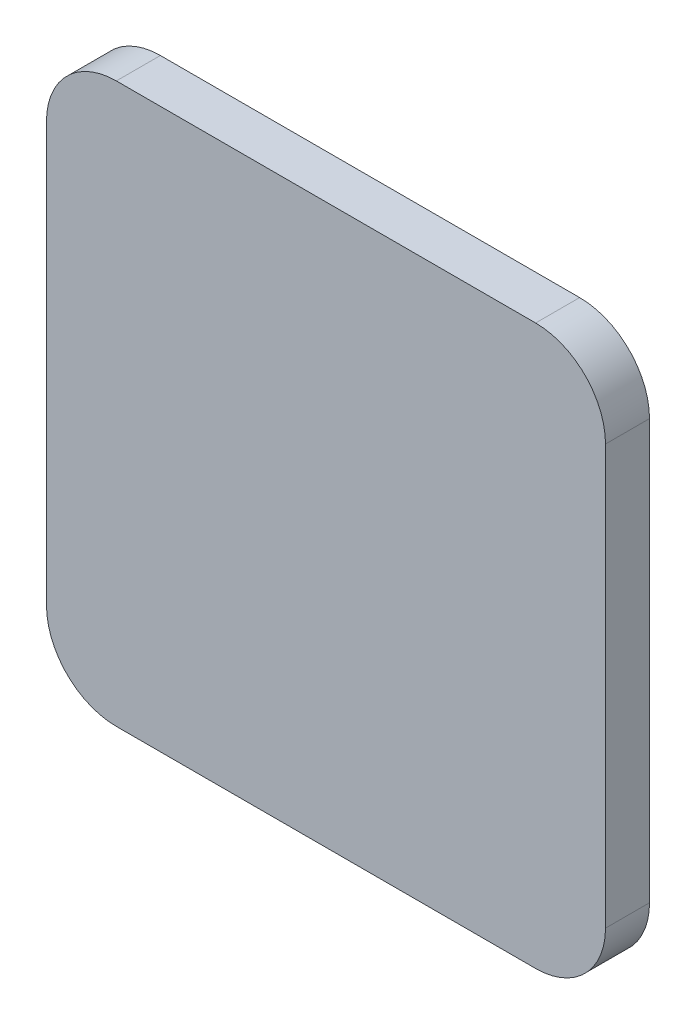
ISO-10303-21;
HEADER;
FILE_DESCRIPTION(('STEP AP214'),'2;1');
FILE_NAME('part.step','',(''),(''),'','','');
FILE_SCHEMA(('AUTOMOTIVE_DESIGN { 1 0 10303 214 1 1 1 1 }'));
ENDSEC;
DATA;
#1=APPLICATION_CONTEXT('core data for automotive mechanical design processes');
#2=APPLICATION_PROTOCOL_DEFINITION('international standard','automotive_design',2000,#1);
#3=PRODUCT_CONTEXT('',#1,'mechanical');
#4=PRODUCT('Part','Part','',(#3));
#5=PRODUCT_RELATED_PRODUCT_CATEGORY('part','',(#4));
#6=PRODUCT_DEFINITION_FORMATION('','',#4);
#7=PRODUCT_DEFINITION_CONTEXT('part definition',#1,'design');
#8=PRODUCT_DEFINITION('design','',#6,#7);
#9=PRODUCT_DEFINITION_SHAPE('','',#8);
#10=(LENGTH_UNIT() NAMED_UNIT(*) SI_UNIT(.MILLI.,.METRE.));
#11=(NAMED_UNIT(*) PLANE_ANGLE_UNIT() SI_UNIT($,.RADIAN.));
#12=(NAMED_UNIT(*) SI_UNIT($,.STERADIAN.) SOLID_ANGLE_UNIT());
#13=UNCERTAINTY_MEASURE_WITH_UNIT(LENGTH_MEASURE(1.E-05),#10,'distance_accuracy_value','');
#14=(GEOMETRIC_REPRESENTATION_CONTEXT(3) GLOBAL_UNCERTAINTY_ASSIGNED_CONTEXT((#13)) GLOBAL_UNIT_ASSIGNED_CONTEXT((#10,
#11,#12)) REPRESENTATION_CONTEXT('',''));
#15=CARTESIAN_POINT('',(0.,0.,0.));
#16=DIRECTION('',(0.,0.,1.));
#17=DIRECTION('',(1.,0.,0.));
#18=AXIS2_PLACEMENT_3D('',#15,#16,#17);
#19=CARTESIAN_POINT('',(7.62000000000001,-7.62000000000001,3.9));
#20=DIRECTION('',(0.,0.,-1.));
#21=DIRECTION('',(-1.,0.,0.));
#22=AXIS2_PLACEMENT_3D('',#19,#20,#21);
#23=CYLINDRICAL_SURFACE('',#22,2.54);
#24=CARTESIAN_POINT('',(7.62000000000001,-7.62000000000001,2.3));
#25=DIRECTION('',(0.,0.,1.));
#26=DIRECTION('',(-1.,0.,0.));
#27=AXIS2_PLACEMENT_3D('',#24,#25,#26);
#28=CIRCLE('',#27,2.54);
#29=CARTESIAN_POINT('',(7.62000000000001,-10.16,2.3));
#30=VERTEX_POINT('',#29);
#31=CARTESIAN_POINT('',(10.16,-7.62000000000001,2.3));
#32=VERTEX_POINT('',#31);
#33=EDGE_CURVE('E134',#30,#32,#28,.T.);
#34=ORIENTED_EDGE('',*,*,#33,.T.);
#35=DIRECTION('',(0.,0.,-1.));
#36=VECTOR('',#35,1.);
#37=CARTESIAN_POINT('',(10.16,-7.62000000000001,3.9));
#38=LINE('',#37,#36);
#39=CARTESIAN_POINT('',(10.16,-7.62000000000001,3.9));
#40=VERTEX_POINT('',#39);
#41=EDGE_CURVE('E11',#40,#32,#38,.T.);
#42=ORIENTED_EDGE('',*,*,#41,.F.);
#43=CARTESIAN_POINT('',(7.62000000000001,-7.62000000000001,3.9));
#44=DIRECTION('',(0.,0.,1.));
#45=DIRECTION('',(-1.,0.,0.));
#46=AXIS2_PLACEMENT_3D('',#43,#44,#45);
#47=CIRCLE('',#46,2.54);
#48=CARTESIAN_POINT('',(7.62000000000001,-10.16,3.9));
#49=VERTEX_POINT('',#48);
#50=EDGE_CURVE('E148',#49,#40,#47,.T.);
#51=ORIENTED_EDGE('',*,*,#50,.F.);
#52=DIRECTION('',(0.,0.,-1.));
#53=VECTOR('',#52,1.);
#54=CARTESIAN_POINT('',(7.62000000000001,-10.16,3.9));
#55=LINE('',#54,#53);
#56=EDGE_CURVE('E130',#49,#30,#55,.T.);
#57=ORIENTED_EDGE('',*,*,#56,.T.);
#58=EDGE_LOOP('',(#34,#42,#51,#57));
#59=FACE_BOUND('',#58,.T.);
#60=ADVANCED_FACE('F38',(#59),#23,.T.);
#61=CARTESIAN_POINT('',(10.16,7.62000000000001,3.9));
#62=DIRECTION('',(-1.,0.,0.));
#63=DIRECTION('',(0.,0.,1.));
#64=AXIS2_PLACEMENT_3D('',#61,#62,#63);
#65=PLANE('',#64);
#66=DIRECTION('',(0.,1.,0.));
#67=VECTOR('',#66,1.);
#68=CARTESIAN_POINT('',(10.16,7.62000000000001,2.3));
#69=LINE('',#68,#67);
#70=CARTESIAN_POINT('',(10.16,7.62000000000001,2.3));
#71=VERTEX_POINT('',#70);
#72=EDGE_CURVE('E137',#32,#71,#69,.T.);
#73=ORIENTED_EDGE('',*,*,#72,.T.);
#74=DIRECTION('',(0.,0.,-1.));
#75=VECTOR('',#74,1.);
#76=CARTESIAN_POINT('',(10.16,7.62000000000001,3.9));
#77=LINE('',#76,#75);
#78=CARTESIAN_POINT('',(10.16,7.62000000000001,3.9));
#79=VERTEX_POINT('',#78);
#80=EDGE_CURVE('E46',#79,#71,#77,.T.);
#81=ORIENTED_EDGE('',*,*,#80,.F.);
#82=DIRECTION('',(0.,1.,0.));
#83=VECTOR('',#82,1.);
#84=CARTESIAN_POINT('',(10.16,7.62000000000001,3.9));
#85=LINE('',#84,#83);
#86=EDGE_CURVE('E97',#40,#79,#85,.T.);
#87=ORIENTED_EDGE('',*,*,#86,.F.);
#88=ORIENTED_EDGE('',*,*,#41,.T.);
#89=EDGE_LOOP('',(#73,#81,#87,#88));
#90=FACE_BOUND('',#89,.T.);
#91=ADVANCED_FACE('F183',(#90),#65,.F.);
#92=CARTESIAN_POINT('',(7.62000000000002,7.62000000000001,3.9));
#93=DIRECTION('',(0.,0.,-1.));
#94=DIRECTION('',(-1.,0.,0.));
#95=AXIS2_PLACEMENT_3D('',#92,#93,#94);
#96=CYLINDRICAL_SURFACE('',#95,2.54);
#97=CARTESIAN_POINT('',(7.62000000000002,7.62000000000001,2.3));
#98=DIRECTION('',(0.,0.,1.));
#99=DIRECTION('',(-1.,0.,0.));
#100=AXIS2_PLACEMENT_3D('',#97,#98,#99);
#101=CIRCLE('',#100,2.54);
#102=CARTESIAN_POINT('',(7.62000000000002,10.16,2.3));
#103=VERTEX_POINT('',#102);
#104=EDGE_CURVE('E139',#71,#103,#101,.T.);
#105=ORIENTED_EDGE('',*,*,#104,.T.);
#106=DIRECTION('',(0.,0.,-1.));
#107=VECTOR('',#106,1.);
#108=CARTESIAN_POINT('',(7.62000000000002,10.16,3.9));
#109=LINE('',#108,#107);
#110=CARTESIAN_POINT('',(7.62000000000002,10.16,3.9));
#111=VERTEX_POINT('',#110);
#112=EDGE_CURVE('E155',#111,#103,#109,.T.);
#113=ORIENTED_EDGE('',*,*,#112,.F.);
#114=CARTESIAN_POINT('',(7.62000000000002,7.62000000000001,3.9));
#115=DIRECTION('',(0.,0.,1.));
#116=DIRECTION('',(-1.,0.,0.));
#117=AXIS2_PLACEMENT_3D('',#114,#115,#116);
#118=CIRCLE('',#117,2.54);
#119=EDGE_CURVE('E163',#79,#111,#118,.T.);
#120=ORIENTED_EDGE('',*,*,#119,.F.);
#121=ORIENTED_EDGE('',*,*,#80,.T.);
#122=EDGE_LOOP('',(#105,#113,#120,#121));
#123=FACE_BOUND('',#122,.T.);
#124=ADVANCED_FACE('F161',(#123),#96,.T.);
#125=CARTESIAN_POINT('',(-7.62000000000001,10.16,3.9));
#126=DIRECTION('',(0.,-1.,0.));
#127=DIRECTION('',(0.,0.,-1.));
#128=AXIS2_PLACEMENT_3D('',#125,#126,#127);
#129=PLANE('',#128);
#130=DIRECTION('',(-1.,0.,0.));
#131=VECTOR('',#130,1.);
#132=CARTESIAN_POINT('',(-7.62000000000001,10.16,2.3));
#133=LINE('',#132,#131);
#134=CARTESIAN_POINT('',(-7.62000000000001,10.16,2.3));
#135=VERTEX_POINT('',#134);
#136=EDGE_CURVE('E141',#103,#135,#133,.T.);
#137=ORIENTED_EDGE('',*,*,#136,.T.);
#138=DIRECTION('',(0.,0.,-1.));
#139=VECTOR('',#138,1.);
#140=CARTESIAN_POINT('',(-7.62000000000001,10.16,3.9));
#141=LINE('',#140,#139);
#142=CARTESIAN_POINT('',(-7.62000000000001,10.16,3.9));
#143=VERTEX_POINT('',#142);
#144=EDGE_CURVE('E152',#143,#135,#141,.T.);
#145=ORIENTED_EDGE('',*,*,#144,.F.);
#146=DIRECTION('',(-1.,0.,0.));
#147=VECTOR('',#146,1.);
#148=CARTESIAN_POINT('',(-7.62000000000001,10.16,3.9));
#149=LINE('',#148,#147);
#150=EDGE_CURVE('E175',#111,#143,#149,.T.);
#151=ORIENTED_EDGE('',*,*,#150,.F.);
#152=ORIENTED_EDGE('',*,*,#112,.T.);
#153=EDGE_LOOP('',(#137,#145,#151,#152));
#154=FACE_BOUND('',#153,.T.);
#155=ADVANCED_FACE('F171',(#154),#129,.F.);
#156=CARTESIAN_POINT('',(-7.62000000000001,7.62000000000001,3.9));
#157=DIRECTION('',(0.,0.,-1.));
#158=DIRECTION('',(-1.,0.,0.));
#159=AXIS2_PLACEMENT_3D('',#156,#157,#158);
#160=CYLINDRICAL_SURFACE('',#159,2.54);
#161=CARTESIAN_POINT('',(-7.62000000000001,7.62000000000001,2.3));
#162=DIRECTION('',(0.,0.,1.));
#163=DIRECTION('',(-1.,0.,0.));
#164=AXIS2_PLACEMENT_3D('',#161,#162,#163);
#165=CIRCLE('',#164,2.54);
#166=CARTESIAN_POINT('',(-10.16,7.62000000000001,2.3));
#167=VERTEX_POINT('',#166);
#168=EDGE_CURVE('E143',#135,#167,#165,.T.);
#169=ORIENTED_EDGE('',*,*,#168,.T.);
#170=DIRECTION('',(0.,0.,-1.));
#171=VECTOR('',#170,1.);
#172=CARTESIAN_POINT('',(-10.16,7.62000000000001,3.9));
#173=LINE('',#172,#171);
#174=CARTESIAN_POINT('',(-10.16,7.62000000000001,3.9));
#175=VERTEX_POINT('',#174);
#176=EDGE_CURVE('E125',#175,#167,#173,.T.);
#177=ORIENTED_EDGE('',*,*,#176,.F.);
#178=CARTESIAN_POINT('',(-7.62000000000001,7.62000000000001,3.9));
#179=DIRECTION('',(0.,0.,1.));
#180=DIRECTION('',(-1.,0.,0.));
#181=AXIS2_PLACEMENT_3D('',#178,#179,#180);
#182=CIRCLE('',#181,2.54);
#183=EDGE_CURVE('E116',#143,#175,#182,.T.);
#184=ORIENTED_EDGE('',*,*,#183,.F.);
#185=ORIENTED_EDGE('',*,*,#144,.T.);
#186=EDGE_LOOP('',(#169,#177,#184,#185));
#187=FACE_BOUND('',#186,.T.);
#188=ADVANCED_FACE('F174',(#187),#160,.T.);
#189=CARTESIAN_POINT('',(-10.16,7.62000000000001,3.9));
#190=DIRECTION('',(1.,0.,0.));
#191=DIRECTION('',(0.,1.,0.));
#192=AXIS2_PLACEMENT_3D('',#189,#190,#191);
#193=PLANE('',#192);
#194=DIRECTION('',(0.,-1.,0.));
#195=VECTOR('',#194,1.);
#196=CARTESIAN_POINT('',(-10.16,7.62000000000001,2.3));
#197=LINE('',#196,#195);
#198=CARTESIAN_POINT('',(-10.16,-7.62000000000001,2.3));
#199=VERTEX_POINT('',#198);
#200=EDGE_CURVE('E124',#167,#199,#197,.T.);
#201=ORIENTED_EDGE('',*,*,#200,.T.);
#202=DIRECTION('',(0.,0.,-1.));
#203=VECTOR('',#202,1.);
#204=CARTESIAN_POINT('',(-10.16,-7.62000000000001,3.9));
#205=LINE('',#204,#203);
#206=CARTESIAN_POINT('',(-10.16,-7.62000000000001,3.9));
#207=VERTEX_POINT('',#206);
#208=EDGE_CURVE('E121',#207,#199,#205,.T.);
#209=ORIENTED_EDGE('',*,*,#208,.F.);
#210=DIRECTION('',(0.,-1.,0.));
#211=VECTOR('',#210,1.);
#212=CARTESIAN_POINT('',(-10.16,7.62000000000001,3.9));
#213=LINE('',#212,#211);
#214=EDGE_CURVE('E110',#175,#207,#213,.T.);
#215=ORIENTED_EDGE('',*,*,#214,.F.);
#216=ORIENTED_EDGE('',*,*,#176,.T.);
#217=EDGE_LOOP('',(#201,#209,#215,#216));
#218=FACE_BOUND('',#217,.T.);
#219=ADVANCED_FACE('F122',(#218),#193,.F.);
#220=CARTESIAN_POINT('',(-7.62000000000001,-7.62000000000001,3.9));
#221=DIRECTION('',(0.,0.,-1.));
#222=DIRECTION('',(-1.,0.,0.));
#223=AXIS2_PLACEMENT_3D('',#220,#221,#222);
#224=CYLINDRICAL_SURFACE('',#223,2.54);
#225=CARTESIAN_POINT('',(-7.62000000000001,-7.62000000000001,2.3));
#226=DIRECTION('',(0.,0.,1.));
#227=DIRECTION('',(1.,0.,0.));
#228=AXIS2_PLACEMENT_3D('',#225,#226,#227);
#229=CIRCLE('',#228,2.54);
#230=CARTESIAN_POINT('',(-7.62,-10.16,2.3));
#231=VERTEX_POINT('',#230);
#232=EDGE_CURVE('E83',#199,#231,#229,.T.);
#233=ORIENTED_EDGE('',*,*,#232,.T.);
#234=DIRECTION('',(0.,0.,-1.));
#235=VECTOR('',#234,1.);
#236=CARTESIAN_POINT('',(-7.62,-10.16,3.9));
#237=LINE('',#236,#235);
#238=CARTESIAN_POINT('',(-7.62,-10.16,3.9));
#239=VERTEX_POINT('',#238);
#240=EDGE_CURVE('E126',#239,#231,#237,.T.);
#241=ORIENTED_EDGE('',*,*,#240,.F.);
#242=CARTESIAN_POINT('',(-7.62000000000001,-7.62000000000001,3.9));
#243=DIRECTION('',(0.,0.,1.));
#244=DIRECTION('',(1.,0.,0.));
#245=AXIS2_PLACEMENT_3D('',#242,#243,#244);
#246=CIRCLE('',#245,2.54);
#247=EDGE_CURVE('E114',#207,#239,#246,.T.);
#248=ORIENTED_EDGE('',*,*,#247,.F.);
#249=ORIENTED_EDGE('',*,*,#208,.T.);
#250=EDGE_LOOP('',(#233,#241,#248,#249));
#251=FACE_BOUND('',#250,.T.);
#252=ADVANCED_FACE('F128',(#251),#224,.T.);
#253=CARTESIAN_POINT('',(-7.62,-10.16,3.9));
#254=DIRECTION('',(0.,1.,0.));
#255=DIRECTION('',(-1.,0.,0.));
#256=AXIS2_PLACEMENT_3D('',#253,#254,#255);
#257=PLANE('',#256);
#258=DIRECTION('',(1.,0.,0.));
#259=VECTOR('',#258,1.);
#260=CARTESIAN_POINT('',(-7.62,-10.16,2.3));
#261=LINE('',#260,#259);
#262=EDGE_CURVE('E89',#231,#30,#261,.T.);
#263=ORIENTED_EDGE('',*,*,#262,.T.);
#264=ORIENTED_EDGE('',*,*,#56,.F.);
#265=DIRECTION('',(1.,0.,0.));
#266=VECTOR('',#265,1.);
#267=CARTESIAN_POINT('',(-7.62,-10.16,3.9));
#268=LINE('',#267,#266);
#269=EDGE_CURVE('E54',#239,#49,#268,.T.);
#270=ORIENTED_EDGE('',*,*,#269,.F.);
#271=ORIENTED_EDGE('',*,*,#240,.T.);
#272=EDGE_LOOP('',(#263,#264,#270,#271));
#273=FACE_BOUND('',#272,.T.);
#274=ADVANCED_FACE('F199',(#273),#257,.F.);
#275=CARTESIAN_POINT('',(7.62000000000001,-7.62000000000001,3.9));
#276=DIRECTION('',(0.,0.,-1.));
#277=DIRECTION('',(-1.,0.,0.));
#278=AXIS2_PLACEMENT_3D('',#275,#276,#277);
#279=PLANE('',#278);
#280=ORIENTED_EDGE('',*,*,#50,.T.);
#281=ORIENTED_EDGE('',*,*,#86,.T.);
#282=ORIENTED_EDGE('',*,*,#119,.T.);
#283=ORIENTED_EDGE('',*,*,#150,.T.);
#284=ORIENTED_EDGE('',*,*,#183,.T.);
#285=ORIENTED_EDGE('',*,*,#214,.T.);
#286=ORIENTED_EDGE('',*,*,#247,.T.);
#287=ORIENTED_EDGE('',*,*,#269,.T.);
#288=EDGE_LOOP('',(#280,#281,#282,#283,#284,#285,#286,#287));
#289=FACE_BOUND('',#288,.T.);
#290=ADVANCED_FACE('F112',(#289),#279,.F.);
#291=CARTESIAN_POINT('',(7.62000000000001,-7.62000000000001,2.3));
#292=DIRECTION('',(0.,0.,-1.));
#293=DIRECTION('',(-1.,0.,0.));
#294=AXIS2_PLACEMENT_3D('',#291,#292,#293);
#295=PLANE('',#294);
#296=ORIENTED_EDGE('',*,*,#33,.F.);
#297=ORIENTED_EDGE('',*,*,#262,.F.);
#298=ORIENTED_EDGE('',*,*,#232,.F.);
#299=ORIENTED_EDGE('',*,*,#200,.F.);
#300=ORIENTED_EDGE('',*,*,#168,.F.);
#301=ORIENTED_EDGE('',*,*,#136,.F.);
#302=ORIENTED_EDGE('',*,*,#104,.F.);
#303=ORIENTED_EDGE('',*,*,#72,.F.);
#304=EDGE_LOOP('',(#296,#297,#298,#299,#300,#301,#302,#303));
#305=FACE_BOUND('',#304,.T.);
#306=ADVANCED_FACE('F167',(#305),#295,.T.);
#307=CLOSED_SHELL('',(#60,#91,#124,#155,#188,#219,#252,#274,#290,#306));
#308=MANIFOLD_SOLID_BREP('B2',#307);
#309=ADVANCED_BREP_SHAPE_REPRESENTATION('',(#18,#308),#14);
#310=SHAPE_DEFINITION_REPRESENTATION(#9,#309);
ENDSEC;
END-ISO-10303-21;
